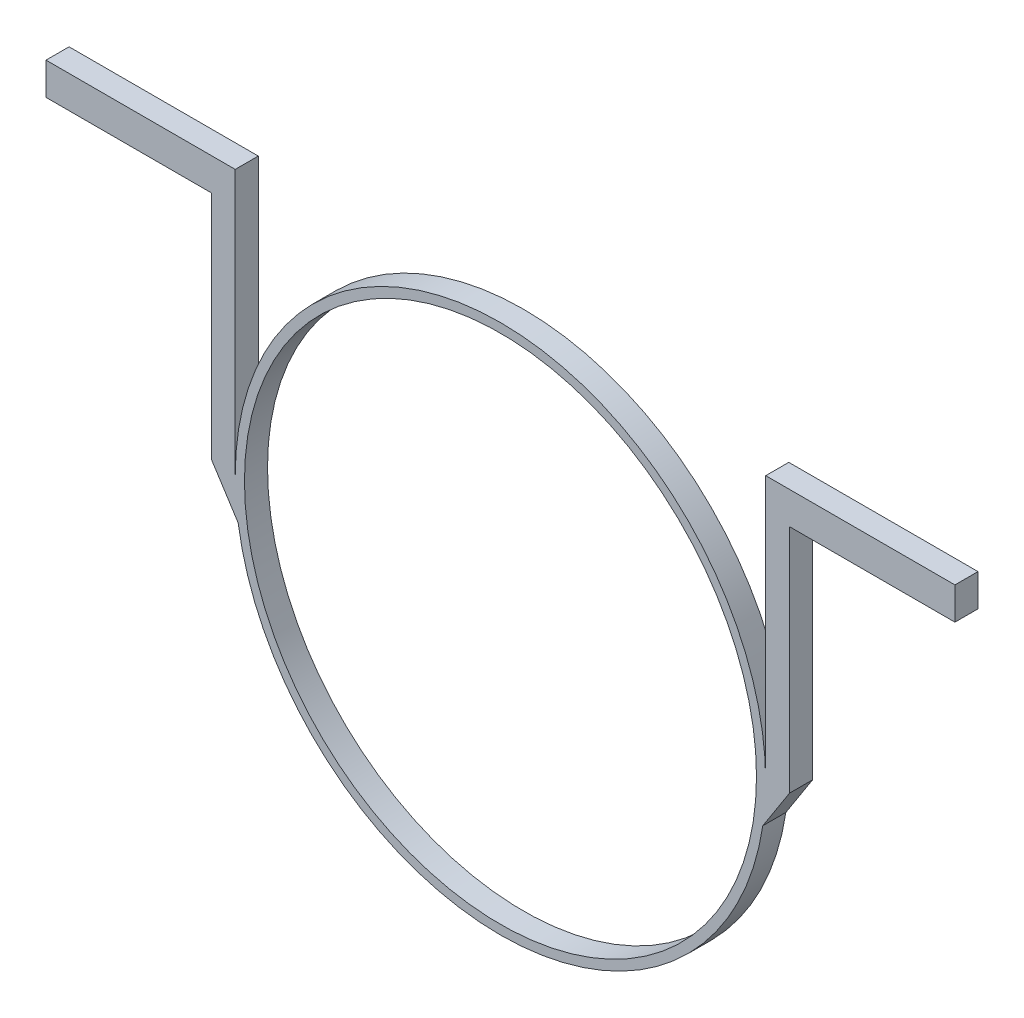
ISO-10303-21;
HEADER;
FILE_DESCRIPTION(('STEP AP214'),'2;1');
FILE_NAME('part.step','',(''),(''),'','','');
FILE_SCHEMA(('AUTOMOTIVE_DESIGN { 1 0 10303 214 1 1 1 1 }'));
ENDSEC;
DATA;
#1=APPLICATION_CONTEXT('core data for automotive mechanical design processes');
#2=APPLICATION_PROTOCOL_DEFINITION('international standard','automotive_design',2000,#1);
#3=PRODUCT_CONTEXT('',#1,'mechanical');
#4=PRODUCT('Part','Part','',(#3));
#5=PRODUCT_RELATED_PRODUCT_CATEGORY('part','',(#4));
#6=PRODUCT_DEFINITION_FORMATION('','',#4);
#7=PRODUCT_DEFINITION_CONTEXT('part definition',#1,'design');
#8=PRODUCT_DEFINITION('design','',#6,#7);
#9=PRODUCT_DEFINITION_SHAPE('','',#8);
#10=(LENGTH_UNIT() NAMED_UNIT(*) SI_UNIT(.MILLI.,.METRE.));
#11=(NAMED_UNIT(*) PLANE_ANGLE_UNIT() SI_UNIT($,.RADIAN.));
#12=(NAMED_UNIT(*) SI_UNIT($,.STERADIAN.) SOLID_ANGLE_UNIT());
#13=UNCERTAINTY_MEASURE_WITH_UNIT(LENGTH_MEASURE(1.E-05),#10,'distance_accuracy_value','');
#14=(GEOMETRIC_REPRESENTATION_CONTEXT(3) GLOBAL_UNCERTAINTY_ASSIGNED_CONTEXT((#13)) GLOBAL_UNIT_ASSIGNED_CONTEXT((#10,
#11,#12)) REPRESENTATION_CONTEXT('',''));
#15=CARTESIAN_POINT('',(0.,0.,0.));
#16=DIRECTION('',(0.,0.,1.));
#17=DIRECTION('',(1.,0.,0.));
#18=AXIS2_PLACEMENT_3D('',#15,#16,#17);
#19=CARTESIAN_POINT('',(-44.1241040214115,-28.3645262923232,5.));
#20=DIRECTION('',(0.841186879513536,0.54074451798819,0.));
#21=DIRECTION('',(-0.54074451798819,0.841186879513536,0.));
#22=AXIS2_PLACEMENT_3D('',#19,#20,#21);
#23=PLANE('',#22);
#24=DIRECTION('',(0.54074451798819,-0.841186879513536,0.));
#25=VECTOR('',#24,1.);
#26=CARTESIAN_POINT('',(-44.1241040214115,-28.3645262923232,0.));
#27=LINE('',#26,#25);
#28=CARTESIAN_POINT('',(-62.6628331127034,0.474482066872485,0.));
#29=VERTEX_POINT('',#28);
#30=CARTESIAN_POINT('',(-56.8605269295939,-8.55163594225839,0.));
#31=VERTEX_POINT('',#30);
#32=EDGE_CURVE('E171',#29,#31,#27,.T.);
#33=ORIENTED_EDGE('',*,*,#32,.T.);
#34=DIRECTION('',(0.,0.,-1.));
#35=VECTOR('',#34,1.);
#36=CARTESIAN_POINT('',(-56.8605269295939,-8.55163594225839,5.));
#37=LINE('',#36,#35);
#38=CARTESIAN_POINT('',(-56.8605269295939,-8.55163594225839,5.));
#39=VERTEX_POINT('',#38);
#40=EDGE_CURVE('E11',#39,#31,#37,.T.);
#41=ORIENTED_EDGE('',*,*,#40,.F.);
#42=DIRECTION('',(0.54074451798819,-0.841186879513536,0.));
#43=VECTOR('',#42,1.);
#44=CARTESIAN_POINT('',(-44.1241040214115,-28.3645262923232,5.));
#45=LINE('',#44,#43);
#46=CARTESIAN_POINT('',(-62.6628331127034,0.474482066872485,5.));
#47=VERTEX_POINT('',#46);
#48=EDGE_CURVE('E206',#47,#39,#45,.T.);
#49=ORIENTED_EDGE('',*,*,#48,.F.);
#50=DIRECTION('',(0.,0.,-1.));
#51=VECTOR('',#50,1.);
#52=CARTESIAN_POINT('',(-62.6628331127034,0.474482066872485,5.));
#53=LINE('',#52,#51);
#54=EDGE_CURVE('E170',#47,#29,#53,.T.);
#55=ORIENTED_EDGE('',*,*,#54,.T.);
#56=EDGE_LOOP('',(#33,#41,#49,#55));
#57=FACE_BOUND('',#56,.T.);
#58=ADVANCED_FACE('F35',(#57),#23,.F.);
#59=CARTESIAN_POINT('',(0.,0.,5.));
#60=DIRECTION('',(0.,0.,-1.));
#61=DIRECTION('',(-1.,0.,0.));
#62=AXIS2_PLACEMENT_3D('',#59,#60,#61);
#63=CYLINDRICAL_SURFACE('',#62,57.5);
#64=CARTESIAN_POINT('',(0.,0.,0.));
#65=DIRECTION('',(0.,0.,1.));
#66=DIRECTION('',(1.,0.,0.));
#67=AXIS2_PLACEMENT_3D('',#64,#65,#66);
#68=CIRCLE('',#67,57.5);
#69=CARTESIAN_POINT('',(56.8605269295939,-8.55163594225839,0.));
#70=VERTEX_POINT('',#69);
#71=EDGE_CURVE('E174',#31,#70,#68,.T.);
#72=ORIENTED_EDGE('',*,*,#71,.T.);
#73=DIRECTION('',(0.,0.,-1.));
#74=VECTOR('',#73,1.);
#75=CARTESIAN_POINT('',(56.8605269295939,-8.55163594225839,5.));
#76=LINE('',#75,#74);
#77=CARTESIAN_POINT('',(56.8605269295939,-8.55163594225839,5.));
#78=VERTEX_POINT('',#77);
#79=EDGE_CURVE('E43',#78,#70,#76,.T.);
#80=ORIENTED_EDGE('',*,*,#79,.F.);
#81=CARTESIAN_POINT('',(0.,0.,5.));
#82=DIRECTION('',(0.,0.,1.));
#83=DIRECTION('',(1.,0.,0.));
#84=AXIS2_PLACEMENT_3D('',#81,#82,#83);
#85=CIRCLE('',#84,57.5);
#86=EDGE_CURVE('E112',#39,#78,#85,.T.);
#87=ORIENTED_EDGE('',*,*,#86,.F.);
#88=ORIENTED_EDGE('',*,*,#40,.T.);
#89=EDGE_LOOP('',(#72,#80,#87,#88));
#90=FACE_BOUND('',#89,.T.);
#91=ADVANCED_FACE('F233',(#90),#63,.T.);
#92=CARTESIAN_POINT('',(44.1241040214115,-28.3645262923232,5.));
#93=DIRECTION('',(0.841186879513536,-0.54074451798819,0.));
#94=DIRECTION('',(0.54074451798819,0.841186879513536,0.));
#95=AXIS2_PLACEMENT_3D('',#92,#93,#94);
#96=PLANE('',#95);
#97=DIRECTION('',(-0.54074451798819,-0.841186879513536,0.));
#98=VECTOR('',#97,1.);
#99=CARTESIAN_POINT('',(44.1241040214115,-28.3645262923232,0.));
#100=LINE('',#99,#98);
#101=CARTESIAN_POINT('',(62.6628331127034,0.474482066872489,0.));
#102=VERTEX_POINT('',#101);
#103=EDGE_CURVE('E177',#102,#70,#100,.T.);
#104=ORIENTED_EDGE('',*,*,#103,.F.);
#105=DIRECTION('',(0.,0.,-1.));
#106=VECTOR('',#105,1.);
#107=CARTESIAN_POINT('',(62.6628331127034,0.474482066872489,5.));
#108=LINE('',#107,#106);
#109=CARTESIAN_POINT('',(62.6628331127034,0.474482066872489,5.));
#110=VERTEX_POINT('',#109);
#111=EDGE_CURVE('E226',#110,#102,#108,.T.);
#112=ORIENTED_EDGE('',*,*,#111,.F.);
#113=DIRECTION('',(-0.54074451798819,-0.841186879513536,0.));
#114=VECTOR('',#113,1.);
#115=CARTESIAN_POINT('',(44.1241040214115,-28.3645262923232,5.));
#116=LINE('',#115,#114);
#117=EDGE_CURVE('E232',#110,#78,#116,.T.);
#118=ORIENTED_EDGE('',*,*,#117,.T.);
#119=ORIENTED_EDGE('',*,*,#79,.T.);
#120=EDGE_LOOP('',(#104,#112,#118,#119));
#121=FACE_BOUND('',#120,.T.);
#122=ADVANCED_FACE('F230',(#121),#96,.T.);
#123=CARTESIAN_POINT('',(62.6628331127034,0.,5.));
#124=DIRECTION('',(1.,0.,0.));
#125=DIRECTION('',(0.,0.,-1.));
#126=AXIS2_PLACEMENT_3D('',#123,#124,#125);
#127=PLANE('',#126);
#128=DIRECTION('',(0.,-1.,0.));
#129=VECTOR('',#128,1.);
#130=CARTESIAN_POINT('',(62.6628331127034,0.,0.));
#131=LINE('',#130,#129);
#132=CARTESIAN_POINT('',(62.6628331127034,50.5,0.));
#133=VERTEX_POINT('',#132);
#134=EDGE_CURVE('E181',#133,#102,#131,.T.);
#135=ORIENTED_EDGE('',*,*,#134,.F.);
#136=DIRECTION('',(0.,0.,-1.));
#137=VECTOR('',#136,1.);
#138=CARTESIAN_POINT('',(62.6628331127034,50.5,5.));
#139=LINE('',#138,#137);
#140=CARTESIAN_POINT('',(62.6628331127034,50.5,5.));
#141=VERTEX_POINT('',#140);
#142=EDGE_CURVE('E224',#141,#133,#139,.T.);
#143=ORIENTED_EDGE('',*,*,#142,.F.);
#144=DIRECTION('',(0.,-1.,0.));
#145=VECTOR('',#144,1.);
#146=CARTESIAN_POINT('',(62.6628331127034,0.,5.));
#147=LINE('',#146,#145);
#148=EDGE_CURVE('E245',#141,#110,#147,.T.);
#149=ORIENTED_EDGE('',*,*,#148,.T.);
#150=ORIENTED_EDGE('',*,*,#111,.T.);
#151=EDGE_LOOP('',(#135,#143,#149,#150));
#152=FACE_BOUND('',#151,.T.);
#153=ADVANCED_FACE('F242',(#152),#127,.T.);
#154=CARTESIAN_POINT('',(0.,50.5,5.));
#155=DIRECTION('',(0.,-1.,0.));
#156=DIRECTION('',(0.,0.,-1.));
#157=AXIS2_PLACEMENT_3D('',#154,#155,#156);
#158=PLANE('',#157);
#159=DIRECTION('',(-1.,0.,0.));
#160=VECTOR('',#159,1.);
#161=CARTESIAN_POINT('',(0.,50.5,0.));
#162=LINE('',#161,#160);
#163=CARTESIAN_POINT('',(98.5181060218645,50.5,0.));
#164=VERTEX_POINT('',#163);
#165=EDGE_CURVE('E184',#164,#133,#162,.T.);
#166=ORIENTED_EDGE('',*,*,#165,.F.);
#167=DIRECTION('',(0.,0.,-1.));
#168=VECTOR('',#167,1.);
#169=CARTESIAN_POINT('',(98.5181060218645,50.5,5.));
#170=LINE('',#169,#168);
#171=CARTESIAN_POINT('',(98.5181060218645,50.5,5.));
#172=VERTEX_POINT('',#171);
#173=EDGE_CURVE('E222',#172,#164,#170,.T.);
#174=ORIENTED_EDGE('',*,*,#173,.F.);
#175=DIRECTION('',(-1.,0.,0.));
#176=VECTOR('',#175,1.);
#177=CARTESIAN_POINT('',(0.,50.5,5.));
#178=LINE('',#177,#176);
#179=EDGE_CURVE('E249',#172,#141,#178,.T.);
#180=ORIENTED_EDGE('',*,*,#179,.T.);
#181=ORIENTED_EDGE('',*,*,#142,.T.);
#182=EDGE_LOOP('',(#166,#174,#180,#181));
#183=FACE_BOUND('',#182,.T.);
#184=ADVANCED_FACE('F322',(#183),#158,.T.);
#185=CARTESIAN_POINT('',(98.5181060218645,0.,5.));
#186=DIRECTION('',(1.,0.,0.));
#187=DIRECTION('',(0.,0.,-1.));
#188=AXIS2_PLACEMENT_3D('',#185,#186,#187);
#189=PLANE('',#188);
#190=DIRECTION('',(0.,-1.,0.));
#191=VECTOR('',#190,1.);
#192=CARTESIAN_POINT('',(98.5181060218645,0.,0.));
#193=LINE('',#192,#191);
#194=CARTESIAN_POINT('',(98.5181060218645,57.5,0.));
#195=VERTEX_POINT('',#194);
#196=EDGE_CURVE('E187',#195,#164,#193,.T.);
#197=ORIENTED_EDGE('',*,*,#196,.F.);
#198=DIRECTION('',(0.,0.,-1.));
#199=VECTOR('',#198,1.);
#200=CARTESIAN_POINT('',(98.5181060218645,57.5,5.));
#201=LINE('',#200,#199);
#202=CARTESIAN_POINT('',(98.5181060218645,57.5,5.));
#203=VERTEX_POINT('',#202);
#204=EDGE_CURVE('E220',#203,#195,#201,.T.);
#205=ORIENTED_EDGE('',*,*,#204,.F.);
#206=DIRECTION('',(0.,-1.,0.));
#207=VECTOR('',#206,1.);
#208=CARTESIAN_POINT('',(98.5181060218645,0.,5.));
#209=LINE('',#208,#207);
#210=EDGE_CURVE('E256',#203,#172,#209,.T.);
#211=ORIENTED_EDGE('',*,*,#210,.T.);
#212=ORIENTED_EDGE('',*,*,#173,.T.);
#213=EDGE_LOOP('',(#197,#205,#211,#212));
#214=FACE_BOUND('',#213,.T.);
#215=ADVANCED_FACE('F315',(#214),#189,.T.);
#216=CARTESIAN_POINT('',(0.,57.5,5.));
#217=DIRECTION('',(0.,1.,0.));
#218=DIRECTION('',(-1.,0.,0.));
#219=AXIS2_PLACEMENT_3D('',#216,#217,#218);
#220=PLANE('',#219);
#221=DIRECTION('',(1.,0.,0.));
#222=VECTOR('',#221,1.);
#223=CARTESIAN_POINT('',(0.,57.5,0.));
#224=LINE('',#223,#222);
#225=CARTESIAN_POINT('',(57.5,57.5,0.));
#226=VERTEX_POINT('',#225);
#227=EDGE_CURVE('E190',#226,#195,#224,.T.);
#228=ORIENTED_EDGE('',*,*,#227,.F.);
#229=DIRECTION('',(0.,0.,-1.));
#230=VECTOR('',#229,1.);
#231=CARTESIAN_POINT('',(57.5,57.5,5.));
#232=LINE('',#231,#230);
#233=CARTESIAN_POINT('',(57.5,57.5,5.));
#234=VERTEX_POINT('',#233);
#235=EDGE_CURVE('E218',#234,#226,#232,.T.);
#236=ORIENTED_EDGE('',*,*,#235,.F.);
#237=DIRECTION('',(1.,0.,0.));
#238=VECTOR('',#237,1.);
#239=CARTESIAN_POINT('',(0.,57.5,5.));
#240=LINE('',#239,#238);
#241=EDGE_CURVE('E259',#234,#203,#240,.T.);
#242=ORIENTED_EDGE('',*,*,#241,.T.);
#243=ORIENTED_EDGE('',*,*,#204,.T.);
#244=EDGE_LOOP('',(#228,#236,#242,#243));
#245=FACE_BOUND('',#244,.T.);
#246=ADVANCED_FACE('F310',(#245),#220,.T.);
#247=CARTESIAN_POINT('',(57.5,0.,5.));
#248=DIRECTION('',(-1.,0.,0.));
#249=DIRECTION('',(0.,-1.,0.));
#250=AXIS2_PLACEMENT_3D('',#247,#248,#249);
#251=PLANE('',#250);
#252=DIRECTION('',(0.,1.,0.));
#253=VECTOR('',#252,1.);
#254=CARTESIAN_POINT('',(57.5,0.,0.));
#255=LINE('',#254,#253);
#256=CARTESIAN_POINT('',(57.5,0.,0.));
#257=VERTEX_POINT('',#256);
#258=EDGE_CURVE('E193',#257,#226,#255,.T.);
#259=ORIENTED_EDGE('',*,*,#258,.F.);
#260=DIRECTION('',(0.,0.,-1.));
#261=VECTOR('',#260,1.);
#262=CARTESIAN_POINT('',(57.5,0.,5.));
#263=LINE('',#262,#261);
#264=CARTESIAN_POINT('',(57.5,0.,5.));
#265=VERTEX_POINT('',#264);
#266=EDGE_CURVE('E216',#265,#257,#263,.T.);
#267=ORIENTED_EDGE('',*,*,#266,.F.);
#268=DIRECTION('',(0.,1.,0.));
#269=VECTOR('',#268,1.);
#270=CARTESIAN_POINT('',(57.5,0.,5.));
#271=LINE('',#270,#269);
#272=EDGE_CURVE('E262',#265,#234,#271,.T.);
#273=ORIENTED_EDGE('',*,*,#272,.T.);
#274=ORIENTED_EDGE('',*,*,#235,.T.);
#275=EDGE_LOOP('',(#259,#267,#273,#274));
#276=FACE_BOUND('',#275,.T.);
#277=ADVANCED_FACE('F305',(#276),#251,.T.);
#278=CARTESIAN_POINT('',(-57.5,0.,0.));
#279=VERTEX_POINT('',#278);
#280=EDGE_CURVE('E178',#257,#279,#68,.T.);
#281=ORIENTED_EDGE('',*,*,#280,.T.);
#282=DIRECTION('',(0.,0.,-1.));
#283=VECTOR('',#282,1.);
#284=CARTESIAN_POINT('',(-57.5,0.,5.));
#285=LINE('',#284,#283);
#286=CARTESIAN_POINT('',(-57.5,0.,5.));
#287=VERTEX_POINT('',#286);
#288=EDGE_CURVE('E213',#287,#279,#285,.T.);
#289=ORIENTED_EDGE('',*,*,#288,.F.);
#290=EDGE_CURVE('E252',#265,#287,#85,.T.);
#291=ORIENTED_EDGE('',*,*,#290,.F.);
#292=ORIENTED_EDGE('',*,*,#266,.T.);
#293=EDGE_LOOP('',(#281,#289,#291,#292));
#294=FACE_BOUND('',#293,.T.);
#295=ADVANCED_FACE('F273',(#294),#63,.T.);
#296=CARTESIAN_POINT('',(-57.5,0.,5.));
#297=DIRECTION('',(-1.,0.,0.));
#298=DIRECTION('',(0.,-1.,0.));
#299=AXIS2_PLACEMENT_3D('',#296,#297,#298);
#300=PLANE('',#299);
#301=DIRECTION('',(0.,1.,0.));
#302=VECTOR('',#301,1.);
#303=CARTESIAN_POINT('',(-57.5,0.,0.));
#304=LINE('',#303,#302);
#305=CARTESIAN_POINT('',(-57.5,57.5,0.));
#306=VERTEX_POINT('',#305);
#307=EDGE_CURVE('E196',#279,#306,#304,.T.);
#308=ORIENTED_EDGE('',*,*,#307,.T.);
#309=DIRECTION('',(0.,0.,-1.));
#310=VECTOR('',#309,1.);
#311=CARTESIAN_POINT('',(-57.5,57.5,5.));
#312=LINE('',#311,#310);
#313=CARTESIAN_POINT('',(-57.5,57.5,5.));
#314=VERTEX_POINT('',#313);
#315=EDGE_CURVE('E210',#314,#306,#312,.T.);
#316=ORIENTED_EDGE('',*,*,#315,.F.);
#317=DIRECTION('',(0.,1.,0.));
#318=VECTOR('',#317,1.);
#319=CARTESIAN_POINT('',(-57.5,0.,5.));
#320=LINE('',#319,#318);
#321=EDGE_CURVE('E265',#287,#314,#320,.T.);
#322=ORIENTED_EDGE('',*,*,#321,.F.);
#323=ORIENTED_EDGE('',*,*,#288,.T.);
#324=EDGE_LOOP('',(#308,#316,#322,#323));
#325=FACE_BOUND('',#324,.T.);
#326=ADVANCED_FACE('F277',(#325),#300,.F.);
#327=CARTESIAN_POINT('',(0.,57.5,5.));
#328=DIRECTION('',(0.,-1.,0.));
#329=DIRECTION('',(1.,0.,0.));
#330=AXIS2_PLACEMENT_3D('',#327,#328,#329);
#331=PLANE('',#330);
#332=DIRECTION('',(-1.,0.,0.));
#333=VECTOR('',#332,1.);
#334=CARTESIAN_POINT('',(0.,57.5,0.));
#335=LINE('',#334,#333);
#336=CARTESIAN_POINT('',(-98.5181060218645,57.5,0.));
#337=VERTEX_POINT('',#336);
#338=EDGE_CURVE('E198',#306,#337,#335,.T.);
#339=ORIENTED_EDGE('',*,*,#338,.T.);
#340=DIRECTION('',(0.,0.,-1.));
#341=VECTOR('',#340,1.);
#342=CARTESIAN_POINT('',(-98.5181060218645,57.5,5.));
#343=LINE('',#342,#341);
#344=CARTESIAN_POINT('',(-98.5181060218645,57.5,5.));
#345=VERTEX_POINT('',#344);
#346=EDGE_CURVE('E159',#345,#337,#343,.T.);
#347=ORIENTED_EDGE('',*,*,#346,.F.);
#348=DIRECTION('',(-1.,0.,0.));
#349=VECTOR('',#348,1.);
#350=CARTESIAN_POINT('',(0.,57.5,5.));
#351=LINE('',#350,#349);
#352=EDGE_CURVE('E150',#314,#345,#351,.T.);
#353=ORIENTED_EDGE('',*,*,#352,.F.);
#354=ORIENTED_EDGE('',*,*,#315,.T.);
#355=EDGE_LOOP('',(#339,#347,#353,#354));
#356=FACE_BOUND('',#355,.T.);
#357=ADVANCED_FACE('F280',(#356),#331,.F.);
#358=CARTESIAN_POINT('',(-98.5181060218645,0.,5.));
#359=DIRECTION('',(1.,0.,0.));
#360=DIRECTION('',(0.,0.,-1.));
#361=AXIS2_PLACEMENT_3D('',#358,#359,#360);
#362=PLANE('',#361);
#363=DIRECTION('',(0.,-1.,0.));
#364=VECTOR('',#363,1.);
#365=CARTESIAN_POINT('',(-98.5181060218645,0.,0.));
#366=LINE('',#365,#364);
#367=CARTESIAN_POINT('',(-98.5181060218645,50.5,0.));
#368=VERTEX_POINT('',#367);
#369=EDGE_CURVE('E158',#337,#368,#366,.T.);
#370=ORIENTED_EDGE('',*,*,#369,.T.);
#371=DIRECTION('',(0.,0.,-1.));
#372=VECTOR('',#371,1.);
#373=CARTESIAN_POINT('',(-98.5181060218645,50.5,5.));
#374=LINE('',#373,#372);
#375=CARTESIAN_POINT('',(-98.5181060218645,50.5,5.));
#376=VERTEX_POINT('',#375);
#377=EDGE_CURVE('E155',#376,#368,#374,.T.);
#378=ORIENTED_EDGE('',*,*,#377,.F.);
#379=DIRECTION('',(0.,-1.,0.));
#380=VECTOR('',#379,1.);
#381=CARTESIAN_POINT('',(-98.5181060218645,0.,5.));
#382=LINE('',#381,#380);
#383=EDGE_CURVE('E143',#345,#376,#382,.T.);
#384=ORIENTED_EDGE('',*,*,#383,.F.);
#385=ORIENTED_EDGE('',*,*,#346,.T.);
#386=EDGE_LOOP('',(#370,#378,#384,#385));
#387=FACE_BOUND('',#386,.T.);
#388=ADVANCED_FACE('F156',(#387),#362,.F.);
#389=CARTESIAN_POINT('',(0.,50.5,5.));
#390=DIRECTION('',(0.,1.,0.));
#391=DIRECTION('',(0.,0.,1.));
#392=AXIS2_PLACEMENT_3D('',#389,#390,#391);
#393=PLANE('',#392);
#394=DIRECTION('',(1.,0.,0.));
#395=VECTOR('',#394,1.);
#396=CARTESIAN_POINT('',(0.,50.5,0.));
#397=LINE('',#396,#395);
#398=CARTESIAN_POINT('',(-62.6628331127034,50.5,0.));
#399=VERTEX_POINT('',#398);
#400=EDGE_CURVE('E98',#368,#399,#397,.T.);
#401=ORIENTED_EDGE('',*,*,#400,.T.);
#402=DIRECTION('',(0.,0.,-1.));
#403=VECTOR('',#402,1.);
#404=CARTESIAN_POINT('',(-62.6628331127034,50.5,5.));
#405=LINE('',#404,#403);
#406=CARTESIAN_POINT('',(-62.6628331127034,50.5,5.));
#407=VERTEX_POINT('',#406);
#408=EDGE_CURVE('E160',#407,#399,#405,.T.);
#409=ORIENTED_EDGE('',*,*,#408,.F.);
#410=DIRECTION('',(1.,0.,0.));
#411=VECTOR('',#410,1.);
#412=CARTESIAN_POINT('',(0.,50.5,5.));
#413=LINE('',#412,#411);
#414=EDGE_CURVE('E148',#376,#407,#413,.T.);
#415=ORIENTED_EDGE('',*,*,#414,.F.);
#416=ORIENTED_EDGE('',*,*,#377,.T.);
#417=EDGE_LOOP('',(#401,#409,#415,#416));
#418=FACE_BOUND('',#417,.T.);
#419=ADVANCED_FACE('F162',(#418),#393,.F.);
#420=CARTESIAN_POINT('',(-62.6628331127034,0.,5.));
#421=DIRECTION('',(1.,0.,0.));
#422=DIRECTION('',(0.,0.,-1.));
#423=AXIS2_PLACEMENT_3D('',#420,#421,#422);
#424=PLANE('',#423);
#425=DIRECTION('',(0.,-1.,0.));
#426=VECTOR('',#425,1.);
#427=CARTESIAN_POINT('',(-62.6628331127034,0.,0.));
#428=LINE('',#427,#426);
#429=EDGE_CURVE('E104',#399,#29,#428,.T.);
#430=ORIENTED_EDGE('',*,*,#429,.T.);
#431=ORIENTED_EDGE('',*,*,#54,.F.);
#432=DIRECTION('',(0.,-1.,0.));
#433=VECTOR('',#432,1.);
#434=CARTESIAN_POINT('',(-62.6628331127034,0.,5.));
#435=LINE('',#434,#433);
#436=EDGE_CURVE('E51',#407,#47,#435,.T.);
#437=ORIENTED_EDGE('',*,*,#436,.F.);
#438=ORIENTED_EDGE('',*,*,#408,.T.);
#439=EDGE_LOOP('',(#430,#431,#437,#438));
#440=FACE_BOUND('',#439,.T.);
#441=ADVANCED_FACE('F283',(#440),#424,.F.);
#442=CARTESIAN_POINT('',(0.,0.,5.));
#443=DIRECTION('',(0.,0.,-1.));
#444=DIRECTION('',(-1.,0.,0.));
#445=AXIS2_PLACEMENT_3D('',#442,#443,#444);
#446=CYLINDRICAL_SURFACE('',#445,55.5);
#447=CARTESIAN_POINT('',(0.,0.,5.));
#448=DIRECTION('',(0.,0.,1.));
#449=DIRECTION('',(1.,0.,0.));
#450=AXIS2_PLACEMENT_3D('',#447,#448,#449);
#451=CIRCLE('',#450,55.5);
#452=CARTESIAN_POINT('',(55.5,0.,5.));
#453=VERTEX_POINT('',#452);
#454=EDGE_CURVE('E164',#453,#453,#451,.T.);
#455=ORIENTED_EDGE('',*,*,#454,.T.);
#456=EDGE_LOOP('',(#455));
#457=FACE_BOUND('',#456,.T.);
#458=CARTESIAN_POINT('',(0.,0.,0.));
#459=DIRECTION('',(0.,0.,1.));
#460=DIRECTION('',(1.,0.,0.));
#461=AXIS2_PLACEMENT_3D('',#458,#459,#460);
#462=CIRCLE('',#461,55.5);
#463=CARTESIAN_POINT('',(55.5,0.,0.));
#464=VERTEX_POINT('',#463);
#465=EDGE_CURVE('E203',#464,#464,#462,.T.);
#466=ORIENTED_EDGE('',*,*,#465,.F.);
#467=EDGE_LOOP('',(#466));
#468=FACE_BOUND('',#467,.T.);
#469=ADVANCED_FACE('F285',(#457,#468),#446,.F.);
#470=CARTESIAN_POINT('',(0.,0.,5.));
#471=DIRECTION('',(0.,0.,1.));
#472=DIRECTION('',(1.,0.,0.));
#473=AXIS2_PLACEMENT_3D('',#470,#471,#472);
#474=PLANE('',#473);
#475=ORIENTED_EDGE('',*,*,#48,.T.);
#476=ORIENTED_EDGE('',*,*,#86,.T.);
#477=ORIENTED_EDGE('',*,*,#117,.F.);
#478=ORIENTED_EDGE('',*,*,#148,.F.);
#479=ORIENTED_EDGE('',*,*,#179,.F.);
#480=ORIENTED_EDGE('',*,*,#210,.F.);
#481=ORIENTED_EDGE('',*,*,#241,.F.);
#482=ORIENTED_EDGE('',*,*,#272,.F.);
#483=ORIENTED_EDGE('',*,*,#290,.T.);
#484=ORIENTED_EDGE('',*,*,#321,.T.);
#485=ORIENTED_EDGE('',*,*,#352,.T.);
#486=ORIENTED_EDGE('',*,*,#383,.T.);
#487=ORIENTED_EDGE('',*,*,#414,.T.);
#488=ORIENTED_EDGE('',*,*,#436,.T.);
#489=EDGE_LOOP('',(#475,#476,#477,#478,#479,#480,#481,#482,#483,#484,#485,#486,#487,#488));
#490=FACE_BOUND('',#489,.T.);
#491=ORIENTED_EDGE('',*,*,#454,.F.);
#492=EDGE_LOOP('',(#491));
#493=FACE_BOUND('',#492,.T.);
#494=ADVANCED_FACE('F145',(#490,#493),#474,.T.);
#495=CARTESIAN_POINT('',(0.,0.,0.));
#496=DIRECTION('',(0.,0.,1.));
#497=DIRECTION('',(1.,0.,0.));
#498=AXIS2_PLACEMENT_3D('',#495,#496,#497);
#499=PLANE('',#498);
#500=ORIENTED_EDGE('',*,*,#32,.F.);
#501=ORIENTED_EDGE('',*,*,#429,.F.);
#502=ORIENTED_EDGE('',*,*,#400,.F.);
#503=ORIENTED_EDGE('',*,*,#369,.F.);
#504=ORIENTED_EDGE('',*,*,#338,.F.);
#505=ORIENTED_EDGE('',*,*,#307,.F.);
#506=ORIENTED_EDGE('',*,*,#280,.F.);
#507=ORIENTED_EDGE('',*,*,#258,.T.);
#508=ORIENTED_EDGE('',*,*,#227,.T.);
#509=ORIENTED_EDGE('',*,*,#196,.T.);
#510=ORIENTED_EDGE('',*,*,#165,.T.);
#511=ORIENTED_EDGE('',*,*,#134,.T.);
#512=ORIENTED_EDGE('',*,*,#103,.T.);
#513=ORIENTED_EDGE('',*,*,#71,.F.);
#514=EDGE_LOOP('',(#500,#501,#502,#503,#504,#505,#506,#507,#508,#509,#510,#511,#512,#513));
#515=FACE_BOUND('',#514,.T.);
#516=ORIENTED_EDGE('',*,*,#465,.T.);
#517=EDGE_LOOP('',(#516));
#518=FACE_BOUND('',#517,.T.);
#519=ADVANCED_FACE('F237',(#515,#518),#499,.F.);
#520=CLOSED_SHELL('',(#58,#91,#122,#153,#184,#215,#246,#277,#295,#326,#357,#388,#419,#441,#469,
#494,#519));
#521=MANIFOLD_SOLID_BREP('B2',#520);
#522=ADVANCED_BREP_SHAPE_REPRESENTATION('',(#18,#521),#14);
#523=SHAPE_DEFINITION_REPRESENTATION(#9,#522);
ENDSEC;
END-ISO-10303-21;
